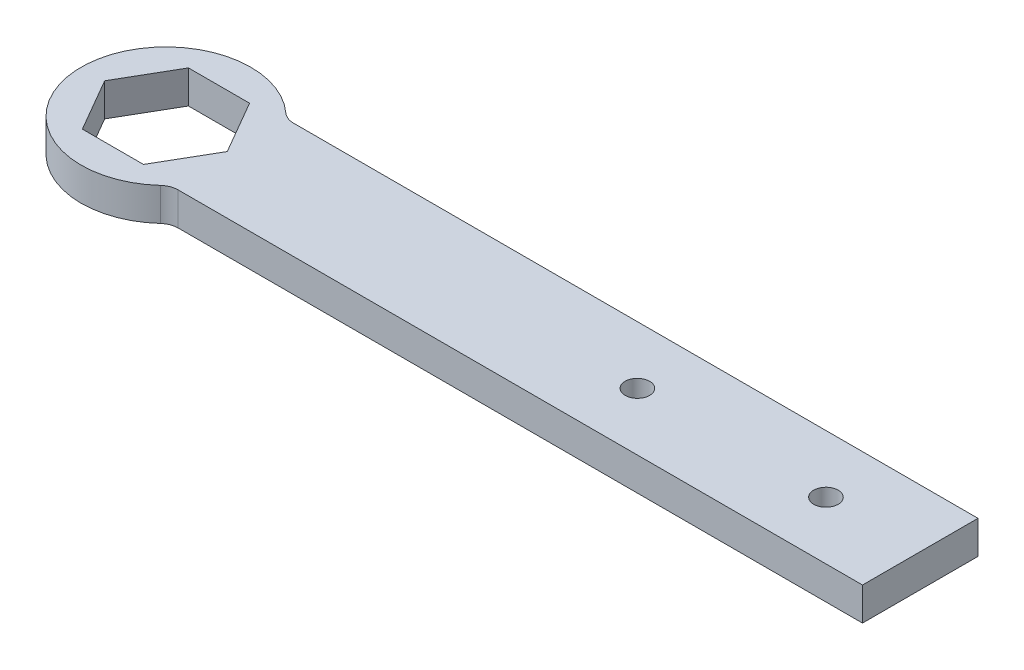
ISO-10303-21;
HEADER;
FILE_DESCRIPTION(('STEP AP214'),'2;1');
FILE_NAME('part.step','',(''),(''),'','','');
FILE_SCHEMA(('AUTOMOTIVE_DESIGN { 1 0 10303 214 1 1 1 1 }'));
ENDSEC;
DATA;
#1=APPLICATION_CONTEXT('core data for automotive mechanical design processes');
#2=APPLICATION_PROTOCOL_DEFINITION('international standard','automotive_design',2000,#1);
#3=PRODUCT_CONTEXT('',#1,'mechanical');
#4=PRODUCT('Part','Part','',(#3));
#5=PRODUCT_RELATED_PRODUCT_CATEGORY('part','',(#4));
#6=PRODUCT_DEFINITION_FORMATION('','',#4);
#7=PRODUCT_DEFINITION_CONTEXT('part definition',#1,'design');
#8=PRODUCT_DEFINITION('design','',#6,#7);
#9=PRODUCT_DEFINITION_SHAPE('','',#8);
#10=(LENGTH_UNIT() NAMED_UNIT(*) SI_UNIT(.MILLI.,.METRE.));
#11=(NAMED_UNIT(*) PLANE_ANGLE_UNIT() SI_UNIT($,.RADIAN.));
#12=(NAMED_UNIT(*) SI_UNIT($,.STERADIAN.) SOLID_ANGLE_UNIT());
#13=UNCERTAINTY_MEASURE_WITH_UNIT(LENGTH_MEASURE(1.E-05),#10,'distance_accuracy_value','');
#14=(GEOMETRIC_REPRESENTATION_CONTEXT(3) GLOBAL_UNCERTAINTY_ASSIGNED_CONTEXT((#13)) GLOBAL_UNIT_ASSIGNED_CONTEXT((#10,
#11,#12)) REPRESENTATION_CONTEXT('',''));
#15=CARTESIAN_POINT('',(0.,0.,0.));
#16=DIRECTION('',(0.,0.,1.));
#17=DIRECTION('',(1.,0.,0.));
#18=AXIS2_PLACEMENT_3D('',#15,#16,#17);
#19=CARTESIAN_POINT('',(13.5355856031245,4.445,17.4625));
#20=DIRECTION('',(0.,1.,0.));
#21=DIRECTION('',(0.,0.,1.));
#22=AXIS2_PLACEMENT_3D('',#19,#20,#21);
#23=PLANE('',#22);
#24=CARTESIAN_POINT('',(67.6183514848975,4.445,7.14374999999999));
#25=DIRECTION('',(0.,1.,0.));
#26=DIRECTION('',(0.,0.,1.));
#27=AXIS2_PLACEMENT_3D('',#24,#25,#26);
#28=CIRCLE('',#27,1.65100000000001);
#29=CARTESIAN_POINT('',(67.6183514848975,4.445,8.79475));
#30=VERTEX_POINT('',#29);
#31=EDGE_CURVE('E303',#30,#30,#28,.T.);
#32=ORIENTED_EDGE('',*,*,#31,.F.);
#33=EDGE_LOOP('',(#32));
#34=FACE_BOUND('',#33,.T.);
#35=CARTESIAN_POINT('',(93.0183514848975,4.445,7.14374999999999));
#36=DIRECTION('',(0.,1.,0.));
#37=DIRECTION('',(0.,0.,1.));
#38=AXIS2_PLACEMENT_3D('',#35,#36,#37);
#39=CIRCLE('',#38,1.65100000000001);
#40=CARTESIAN_POINT('',(93.0183514848975,4.445,8.79474999999999));
#41=VERTEX_POINT('',#40);
#42=EDGE_CURVE('E305',#41,#41,#39,.T.);
#43=ORIENTED_EDGE('',*,*,#42,.F.);
#44=EDGE_LOOP('',(#43));
#45=FACE_BOUND('',#44,.T.);
#46=CARTESIAN_POINT('',(13.5355856031245,4.445,17.4625));
#47=DIRECTION('',(0.,-1.,0.));
#48=DIRECTION('',(0.,0.,1.));
#49=AXIS2_PLACEMENT_3D('',#46,#47,#48);
#50=CIRCLE('',#49,2.54);
#51=CARTESIAN_POINT('',(11.8233612179923,4.445,15.5863636363636));
#52=VERTEX_POINT('',#51);
#53=CARTESIAN_POINT('',(13.5355856031245,4.445,14.9225));
#54=VERTEX_POINT('',#53);
#55=EDGE_CURVE('E185',#52,#54,#50,.T.);
#56=ORIENTED_EDGE('',*,*,#55,.T.);
#57=DIRECTION('',(1.,0.,0.));
#58=VECTOR('',#57,1.);
#59=CARTESIAN_POINT('',(105.718351484897,4.445,14.9225));
#60=LINE('',#59,#58);
#61=CARTESIAN_POINT('',(105.718351484897,4.445,14.9225));
#62=VERTEX_POINT('',#61);
#63=EDGE_CURVE('E188',#54,#62,#60,.T.);
#64=ORIENTED_EDGE('',*,*,#63,.T.);
#65=DIRECTION('',(0.,0.,-1.));
#66=VECTOR('',#65,1.);
#67=CARTESIAN_POINT('',(105.718351484897,4.445,-0.634999999999997));
#68=LINE('',#67,#66);
#69=CARTESIAN_POINT('',(105.718351484897,4.445,-0.634999999999997));
#70=VERTEX_POINT('',#69);
#71=EDGE_CURVE('E191',#62,#70,#68,.T.);
#72=ORIENTED_EDGE('',*,*,#71,.T.);
#73=DIRECTION('',(-1.,0.,0.));
#74=VECTOR('',#73,1.);
#75=CARTESIAN_POINT('',(13.5355856031245,4.445,-0.634999999999993));
#76=LINE('',#75,#74);
#77=CARTESIAN_POINT('',(13.5355856031245,4.445,-0.634999999999993));
#78=VERTEX_POINT('',#77);
#79=EDGE_CURVE('E193',#70,#78,#76,.T.);
#80=ORIENTED_EDGE('',*,*,#79,.T.);
#81=CARTESIAN_POINT('',(13.5355856031245,4.445,-3.17499999999999));
#82=DIRECTION('',(0.,-1.,0.));
#83=DIRECTION('',(0.,0.,1.));
#84=AXIS2_PLACEMENT_3D('',#81,#82,#83);
#85=CIRCLE('',#84,2.54);
#86=CARTESIAN_POINT('',(11.8233612179923,4.445,-1.29886363636363));
#87=VERTEX_POINT('',#86);
#88=EDGE_CURVE('E195',#78,#87,#85,.T.);
#89=ORIENTED_EDGE('',*,*,#88,.T.);
#90=CARTESIAN_POINT('',(4.11835148489746,4.445,7.14375));
#91=DIRECTION('',(0.,1.,0.));
#92=DIRECTION('',(0.,0.,1.));
#93=AXIS2_PLACEMENT_3D('',#90,#91,#92);
#94=CIRCLE('',#93,11.43);
#95=EDGE_CURVE('E197',#87,#52,#94,.T.);
#96=ORIENTED_EDGE('',*,*,#95,.T.);
#97=EDGE_LOOP('',(#56,#64,#72,#80,#89,#96));
#98=FACE_BOUND('',#97,.T.);
#99=DIRECTION('',(0.501108239261361,0.,0.865384615384615));
#100=VECTOR('',#99,1.);
#101=CARTESIAN_POINT('',(0.,4.445,14.2875));
#102=LINE('',#101,#100);
#103=CARTESIAN_POINT('',(-4.13664851510254,4.445,7.14375));
#104=VERTEX_POINT('',#103);
#105=CARTESIAN_POINT('',(0.,4.445,14.2875));
#106=VERTEX_POINT('',#105);
#107=EDGE_CURVE('E140',#104,#106,#102,.T.);
#108=ORIENTED_EDGE('',*,*,#107,.F.);
#109=DIRECTION('',(-0.501108239261361,0.,0.865384615384615));
#110=VECTOR('',#109,1.);
#111=CARTESIAN_POINT('',(-4.13664851510254,4.445,7.14375));
#112=LINE('',#111,#110);
#113=CARTESIAN_POINT('',(0.,4.445,0.));
#114=VERTEX_POINT('',#113);
#115=EDGE_CURVE('E132',#114,#104,#112,.T.);
#116=ORIENTED_EDGE('',*,*,#115,.F.);
#117=DIRECTION('',(-1.,0.,0.));
#118=VECTOR('',#117,1.);
#119=CARTESIAN_POINT('',(0.,4.445,0.));
#120=LINE('',#119,#118);
#121=CARTESIAN_POINT('',(8.23670296979493,4.445,0.));
#122=VERTEX_POINT('',#121);
#123=EDGE_CURVE('E162',#122,#114,#120,.T.);
#124=ORIENTED_EDGE('',*,*,#123,.F.);
#125=DIRECTION('',(-0.501108239261361,0.,-0.865384615384615));
#126=VECTOR('',#125,1.);
#127=CARTESIAN_POINT('',(8.23670296979493,4.445,0.));
#128=LINE('',#127,#126);
#129=CARTESIAN_POINT('',(12.3733514848975,4.445,7.14375));
#130=VERTEX_POINT('',#129);
#131=EDGE_CURVE('E160',#130,#122,#128,.T.);
#132=ORIENTED_EDGE('',*,*,#131,.F.);
#133=DIRECTION('',(0.501108239261361,0.,-0.865384615384616));
#134=VECTOR('',#133,1.);
#135=CARTESIAN_POINT('',(12.3733514848975,4.445,7.14375));
#136=LINE('',#135,#134);
#137=CARTESIAN_POINT('',(8.23670296979493,4.445,14.2875));
#138=VERTEX_POINT('',#137);
#139=EDGE_CURVE('E155',#138,#130,#136,.T.);
#140=ORIENTED_EDGE('',*,*,#139,.F.);
#141=DIRECTION('',(1.,0.,0.));
#142=VECTOR('',#141,1.);
#143=CARTESIAN_POINT('',(8.23670296979493,4.445,14.2875));
#144=LINE('',#143,#142);
#145=EDGE_CURVE('E153',#106,#138,#144,.T.);
#146=ORIENTED_EDGE('',*,*,#145,.F.);
#147=EDGE_LOOP('',(#108,#116,#124,#132,#140,#146));
#148=FACE_BOUND('',#147,.T.);
#149=ADVANCED_FACE('F43',(#34,#45,#98,#148),#23,.T.);
#150=CARTESIAN_POINT('',(13.5355856031245,0.,17.4625));
#151=DIRECTION('',(0.,1.,0.));
#152=DIRECTION('',(0.,0.,1.));
#153=AXIS2_PLACEMENT_3D('',#150,#151,#152);
#154=PLANE('',#153);
#155=CARTESIAN_POINT('',(67.6183514848975,0.,7.14374999999999));
#156=DIRECTION('',(0.,1.,0.));
#157=DIRECTION('',(0.,0.,1.));
#158=AXIS2_PLACEMENT_3D('',#155,#156,#157);
#159=CIRCLE('',#158,1.65100000000001);
#160=CARTESIAN_POINT('',(67.6183514848975,0.,8.79475));
#161=VERTEX_POINT('',#160);
#162=EDGE_CURVE('E301',#161,#161,#159,.T.);
#163=ORIENTED_EDGE('',*,*,#162,.T.);
#164=EDGE_LOOP('',(#163));
#165=FACE_BOUND('',#164,.T.);
#166=CARTESIAN_POINT('',(93.0183514848975,0.,7.14374999999999));
#167=DIRECTION('',(0.,1.,0.));
#168=DIRECTION('',(0.,0.,1.));
#169=AXIS2_PLACEMENT_3D('',#166,#167,#168);
#170=CIRCLE('',#169,1.65100000000001);
#171=CARTESIAN_POINT('',(93.0183514848975,0.,8.79474999999999));
#172=VERTEX_POINT('',#171);
#173=EDGE_CURVE('E165',#172,#172,#170,.T.);
#174=ORIENTED_EDGE('',*,*,#173,.T.);
#175=EDGE_LOOP('',(#174));
#176=FACE_BOUND('',#175,.T.);
#177=CARTESIAN_POINT('',(13.5355856031245,0.,17.4625));
#178=DIRECTION('',(0.,-1.,0.));
#179=DIRECTION('',(0.,0.,1.));
#180=AXIS2_PLACEMENT_3D('',#177,#178,#179);
#181=CIRCLE('',#180,2.54);
#182=CARTESIAN_POINT('',(11.8233612179923,0.,15.5863636363636));
#183=VERTEX_POINT('',#182);
#184=CARTESIAN_POINT('',(13.5355856031245,0.,14.9225));
#185=VERTEX_POINT('',#184);
#186=EDGE_CURVE('E148',#183,#185,#181,.T.);
#187=ORIENTED_EDGE('',*,*,#186,.F.);
#188=CARTESIAN_POINT('',(4.11835148489746,0.,7.14375));
#189=DIRECTION('',(0.,1.,0.));
#190=DIRECTION('',(0.,0.,1.));
#191=AXIS2_PLACEMENT_3D('',#188,#189,#190);
#192=CIRCLE('',#191,11.43);
#193=CARTESIAN_POINT('',(11.8233612179923,0.,-1.29886363636363));
#194=VERTEX_POINT('',#193);
#195=EDGE_CURVE('E189',#194,#183,#192,.T.);
#196=ORIENTED_EDGE('',*,*,#195,.F.);
#197=CARTESIAN_POINT('',(13.5355856031245,0.,-3.17499999999999));
#198=DIRECTION('',(0.,-1.,0.));
#199=DIRECTION('',(0.,0.,1.));
#200=AXIS2_PLACEMENT_3D('',#197,#198,#199);
#201=CIRCLE('',#200,2.54);
#202=CARTESIAN_POINT('',(13.5355856031245,0.,-0.634999999999993));
#203=VERTEX_POINT('',#202);
#204=EDGE_CURVE('E208',#203,#194,#201,.T.);
#205=ORIENTED_EDGE('',*,*,#204,.F.);
#206=DIRECTION('',(-1.,0.,0.));
#207=VECTOR('',#206,1.);
#208=CARTESIAN_POINT('',(13.5355856031245,0.,-0.634999999999993));
#209=LINE('',#208,#207);
#210=CARTESIAN_POINT('',(105.718351484897,0.,-0.634999999999997));
#211=VERTEX_POINT('',#210);
#212=EDGE_CURVE('E206',#211,#203,#209,.T.);
#213=ORIENTED_EDGE('',*,*,#212,.F.);
#214=DIRECTION('',(0.,0.,-1.));
#215=VECTOR('',#214,1.);
#216=CARTESIAN_POINT('',(105.718351484897,0.,-0.634999999999997));
#217=LINE('',#216,#215);
#218=CARTESIAN_POINT('',(105.718351484897,0.,14.9225));
#219=VERTEX_POINT('',#218);
#220=EDGE_CURVE('E204',#219,#211,#217,.T.);
#221=ORIENTED_EDGE('',*,*,#220,.F.);
#222=DIRECTION('',(1.,0.,0.));
#223=VECTOR('',#222,1.);
#224=CARTESIAN_POINT('',(105.718351484897,0.,14.9225));
#225=LINE('',#224,#223);
#226=EDGE_CURVE('E202',#185,#219,#225,.T.);
#227=ORIENTED_EDGE('',*,*,#226,.F.);
#228=EDGE_LOOP('',(#187,#196,#205,#213,#221,#227));
#229=FACE_BOUND('',#228,.T.);
#230=DIRECTION('',(-0.501108239261361,0.,0.865384615384615));
#231=VECTOR('',#230,1.);
#232=CARTESIAN_POINT('',(-4.13664851510254,0.,7.14375));
#233=LINE('',#232,#231);
#234=CARTESIAN_POINT('',(0.,0.,0.));
#235=VERTEX_POINT('',#234);
#236=CARTESIAN_POINT('',(-4.13664851510254,0.,7.14375));
#237=VERTEX_POINT('',#236);
#238=EDGE_CURVE('E66',#235,#237,#233,.T.);
#239=ORIENTED_EDGE('',*,*,#238,.T.);
#240=DIRECTION('',(0.501108239261361,0.,0.865384615384615));
#241=VECTOR('',#240,1.);
#242=CARTESIAN_POINT('',(0.,0.,14.2875));
#243=LINE('',#242,#241);
#244=CARTESIAN_POINT('',(0.,0.,14.2875));
#245=VERTEX_POINT('',#244);
#246=EDGE_CURVE('E147',#237,#245,#243,.T.);
#247=ORIENTED_EDGE('',*,*,#246,.T.);
#248=DIRECTION('',(1.,0.,0.));
#249=VECTOR('',#248,1.);
#250=CARTESIAN_POINT('',(8.23670296979493,0.,14.2875));
#251=LINE('',#250,#249);
#252=CARTESIAN_POINT('',(8.23670296979493,0.,14.2875));
#253=VERTEX_POINT('',#252);
#254=EDGE_CURVE('E167',#245,#253,#251,.T.);
#255=ORIENTED_EDGE('',*,*,#254,.T.);
#256=DIRECTION('',(0.501108239261361,0.,-0.865384615384616));
#257=VECTOR('',#256,1.);
#258=CARTESIAN_POINT('',(12.3733514848975,0.,7.14375));
#259=LINE('',#258,#257);
#260=CARTESIAN_POINT('',(12.3733514848975,0.,7.14375));
#261=VERTEX_POINT('',#260);
#262=EDGE_CURVE('E170',#253,#261,#259,.T.);
#263=ORIENTED_EDGE('',*,*,#262,.T.);
#264=DIRECTION('',(-0.501108239261361,0.,-0.865384615384615));
#265=VECTOR('',#264,1.);
#266=CARTESIAN_POINT('',(8.23670296979493,0.,0.));
#267=LINE('',#266,#265);
#268=CARTESIAN_POINT('',(8.23670296979493,0.,0.));
#269=VERTEX_POINT('',#268);
#270=EDGE_CURVE('E173',#261,#269,#267,.T.);
#271=ORIENTED_EDGE('',*,*,#270,.T.);
#272=DIRECTION('',(-1.,0.,0.));
#273=VECTOR('',#272,1.);
#274=CARTESIAN_POINT('',(0.,0.,0.));
#275=LINE('',#274,#273);
#276=EDGE_CURVE('E141',#269,#235,#275,.T.);
#277=ORIENTED_EDGE('',*,*,#276,.T.);
#278=EDGE_LOOP('',(#239,#247,#255,#263,#271,#277));
#279=FACE_BOUND('',#278,.T.);
#280=ADVANCED_FACE('F232',(#165,#176,#229,#279),#154,.F.);
#281=CARTESIAN_POINT('',(13.5355856031245,4.445,17.4625));
#282=DIRECTION('',(0.,-1.,0.));
#283=DIRECTION('',(0.,0.,-1.));
#284=AXIS2_PLACEMENT_3D('',#281,#282,#283);
#285=CYLINDRICAL_SURFACE('',#284,2.54);
#286=ORIENTED_EDGE('',*,*,#186,.T.);
#287=DIRECTION('',(0.,-1.,0.));
#288=VECTOR('',#287,1.);
#289=CARTESIAN_POINT('',(13.5355856031245,4.445,14.9225));
#290=LINE('',#289,#288);
#291=EDGE_CURVE('E13',#54,#185,#290,.T.);
#292=ORIENTED_EDGE('',*,*,#291,.F.);
#293=ORIENTED_EDGE('',*,*,#55,.F.);
#294=DIRECTION('',(0.,-1.,0.));
#295=VECTOR('',#294,1.);
#296=CARTESIAN_POINT('',(11.8233612179923,4.445,15.5863636363636));
#297=LINE('',#296,#295);
#298=EDGE_CURVE('E199',#52,#183,#297,.T.);
#299=ORIENTED_EDGE('',*,*,#298,.T.);
#300=EDGE_LOOP('',(#286,#292,#293,#299));
#301=FACE_BOUND('',#300,.T.);
#302=ADVANCED_FACE('F45',(#301),#285,.F.);
#303=CARTESIAN_POINT('',(105.718351484897,4.445,14.9225));
#304=DIRECTION('',(0.,0.,-1.));
#305=DIRECTION('',(-1.,0.,0.));
#306=AXIS2_PLACEMENT_3D('',#303,#304,#305);
#307=PLANE('',#306);
#308=ORIENTED_EDGE('',*,*,#226,.T.);
#309=DIRECTION('',(0.,-1.,0.));
#310=VECTOR('',#309,1.);
#311=CARTESIAN_POINT('',(105.718351484897,4.445,14.9225));
#312=LINE('',#311,#310);
#313=EDGE_CURVE('E51',#62,#219,#312,.T.);
#314=ORIENTED_EDGE('',*,*,#313,.F.);
#315=ORIENTED_EDGE('',*,*,#63,.F.);
#316=ORIENTED_EDGE('',*,*,#291,.T.);
#317=EDGE_LOOP('',(#308,#314,#315,#316));
#318=FACE_BOUND('',#317,.T.);
#319=ADVANCED_FACE('F249',(#318),#307,.F.);
#320=CARTESIAN_POINT('',(105.718351484897,4.445,-0.634999999999997));
#321=DIRECTION('',(-1.,0.,0.));
#322=DIRECTION('',(0.,0.,1.));
#323=AXIS2_PLACEMENT_3D('',#320,#321,#322);
#324=PLANE('',#323);
#325=ORIENTED_EDGE('',*,*,#220,.T.);
#326=DIRECTION('',(0.,-1.,0.));
#327=VECTOR('',#326,1.);
#328=CARTESIAN_POINT('',(105.718351484897,4.445,-0.634999999999997));
#329=LINE('',#328,#327);
#330=EDGE_CURVE('E219',#70,#211,#329,.T.);
#331=ORIENTED_EDGE('',*,*,#330,.F.);
#332=ORIENTED_EDGE('',*,*,#71,.F.);
#333=ORIENTED_EDGE('',*,*,#313,.T.);
#334=EDGE_LOOP('',(#325,#331,#332,#333));
#335=FACE_BOUND('',#334,.T.);
#336=ADVANCED_FACE('F226',(#335),#324,.F.);
#337=CARTESIAN_POINT('',(13.5355856031245,4.445,-0.634999999999993));
#338=DIRECTION('',(0.,0.,1.));
#339=DIRECTION('',(1.,0.,0.));
#340=AXIS2_PLACEMENT_3D('',#337,#338,#339);
#341=PLANE('',#340);
#342=ORIENTED_EDGE('',*,*,#212,.T.);
#343=DIRECTION('',(0.,-1.,0.));
#344=VECTOR('',#343,1.);
#345=CARTESIAN_POINT('',(13.5355856031245,4.445,-0.634999999999993));
#346=LINE('',#345,#344);
#347=EDGE_CURVE('E216',#78,#203,#346,.T.);
#348=ORIENTED_EDGE('',*,*,#347,.F.);
#349=ORIENTED_EDGE('',*,*,#79,.F.);
#350=ORIENTED_EDGE('',*,*,#330,.T.);
#351=EDGE_LOOP('',(#342,#348,#349,#350));
#352=FACE_BOUND('',#351,.T.);
#353=ADVANCED_FACE('F238',(#352),#341,.F.);
#354=CARTESIAN_POINT('',(13.5355856031245,4.445,-3.17499999999999));
#355=DIRECTION('',(0.,-1.,0.));
#356=DIRECTION('',(0.,0.,-1.));
#357=AXIS2_PLACEMENT_3D('',#354,#355,#356);
#358=CYLINDRICAL_SURFACE('',#357,2.54);
#359=ORIENTED_EDGE('',*,*,#204,.T.);
#360=DIRECTION('',(0.,-1.,0.));
#361=VECTOR('',#360,1.);
#362=CARTESIAN_POINT('',(11.8233612179923,4.445,-1.29886363636363));
#363=LINE('',#362,#361);
#364=EDGE_CURVE('E213',#87,#194,#363,.T.);
#365=ORIENTED_EDGE('',*,*,#364,.F.);
#366=ORIENTED_EDGE('',*,*,#88,.F.);
#367=ORIENTED_EDGE('',*,*,#347,.T.);
#368=EDGE_LOOP('',(#359,#365,#366,#367));
#369=FACE_BOUND('',#368,.T.);
#370=ADVANCED_FACE('F242',(#369),#358,.F.);
#371=CARTESIAN_POINT('',(4.11835148489746,4.445,7.14375));
#372=DIRECTION('',(0.,-1.,0.));
#373=DIRECTION('',(0.,0.,-1.));
#374=AXIS2_PLACEMENT_3D('',#371,#372,#373);
#375=CYLINDRICAL_SURFACE('',#374,11.43);
#376=ORIENTED_EDGE('',*,*,#195,.T.);
#377=ORIENTED_EDGE('',*,*,#298,.F.);
#378=ORIENTED_EDGE('',*,*,#95,.F.);
#379=ORIENTED_EDGE('',*,*,#364,.T.);
#380=EDGE_LOOP('',(#376,#377,#378,#379));
#381=FACE_BOUND('',#380,.T.);
#382=ADVANCED_FACE('F252',(#381),#375,.T.);
#383=CARTESIAN_POINT('',(-4.13664851510254,4.445,7.14375));
#384=DIRECTION('',(0.865384615384615,0.,0.501108239261361));
#385=DIRECTION('',(0.501108239261361,0.,-0.865384615384615));
#386=AXIS2_PLACEMENT_3D('',#383,#384,#385);
#387=PLANE('',#386);
#388=ORIENTED_EDGE('',*,*,#238,.F.);
#389=DIRECTION('',(0.,-1.,0.));
#390=VECTOR('',#389,1.);
#391=CARTESIAN_POINT('',(0.,4.445,0.));
#392=LINE('',#391,#390);
#393=EDGE_CURVE('E136',#114,#235,#392,.T.);
#394=ORIENTED_EDGE('',*,*,#393,.F.);
#395=ORIENTED_EDGE('',*,*,#115,.T.);
#396=DIRECTION('',(0.,-1.,0.));
#397=VECTOR('',#396,1.);
#398=CARTESIAN_POINT('',(-4.13664851510254,4.445,7.14375));
#399=LINE('',#398,#397);
#400=EDGE_CURVE('E135',#104,#237,#399,.T.);
#401=ORIENTED_EDGE('',*,*,#400,.T.);
#402=EDGE_LOOP('',(#388,#394,#395,#401));
#403=FACE_BOUND('',#402,.T.);
#404=ADVANCED_FACE('F134',(#403),#387,.T.);
#405=CARTESIAN_POINT('',(0.,4.445,14.2875));
#406=DIRECTION('',(0.865384615384615,0.,-0.501108239261361));
#407=DIRECTION('',(-0.501108239261361,0.,-0.865384615384616));
#408=AXIS2_PLACEMENT_3D('',#405,#406,#407);
#409=PLANE('',#408);
#410=ORIENTED_EDGE('',*,*,#246,.F.);
#411=ORIENTED_EDGE('',*,*,#400,.F.);
#412=ORIENTED_EDGE('',*,*,#107,.T.);
#413=DIRECTION('',(0.,-1.,0.));
#414=VECTOR('',#413,1.);
#415=CARTESIAN_POINT('',(0.,4.445,14.2875));
#416=LINE('',#415,#414);
#417=EDGE_CURVE('E149',#106,#245,#416,.T.);
#418=ORIENTED_EDGE('',*,*,#417,.T.);
#419=EDGE_LOOP('',(#410,#411,#412,#418));
#420=FACE_BOUND('',#419,.T.);
#421=ADVANCED_FACE('F144',(#420),#409,.T.);
#422=CARTESIAN_POINT('',(8.23670296979493,4.445,14.2875));
#423=DIRECTION('',(0.,0.,-1.));
#424=DIRECTION('',(-1.,0.,0.));
#425=AXIS2_PLACEMENT_3D('',#422,#423,#424);
#426=PLANE('',#425);
#427=ORIENTED_EDGE('',*,*,#254,.F.);
#428=ORIENTED_EDGE('',*,*,#417,.F.);
#429=ORIENTED_EDGE('',*,*,#145,.T.);
#430=DIRECTION('',(0.,-1.,0.));
#431=VECTOR('',#430,1.);
#432=CARTESIAN_POINT('',(8.23670296979493,4.445,14.2875));
#433=LINE('',#432,#431);
#434=EDGE_CURVE('E182',#138,#253,#433,.T.);
#435=ORIENTED_EDGE('',*,*,#434,.T.);
#436=EDGE_LOOP('',(#427,#428,#429,#435));
#437=FACE_BOUND('',#436,.T.);
#438=ADVANCED_FACE('F274',(#437),#426,.T.);
#439=CARTESIAN_POINT('',(12.3733514848975,4.445,7.14375));
#440=DIRECTION('',(-0.865384615384615,0.,-0.501108239261361));
#441=DIRECTION('',(-0.501108239261361,0.,0.865384615384616));
#442=AXIS2_PLACEMENT_3D('',#439,#440,#441);
#443=PLANE('',#442);
#444=ORIENTED_EDGE('',*,*,#262,.F.);
#445=ORIENTED_EDGE('',*,*,#434,.F.);
#446=ORIENTED_EDGE('',*,*,#139,.T.);
#447=DIRECTION('',(0.,-1.,0.));
#448=VECTOR('',#447,1.);
#449=CARTESIAN_POINT('',(12.3733514848975,4.445,7.14375));
#450=LINE('',#449,#448);
#451=EDGE_CURVE('E180',#130,#261,#450,.T.);
#452=ORIENTED_EDGE('',*,*,#451,.T.);
#453=EDGE_LOOP('',(#444,#445,#446,#452));
#454=FACE_BOUND('',#453,.T.);
#455=ADVANCED_FACE('F277',(#454),#443,.T.);
#456=CARTESIAN_POINT('',(8.23670296979493,4.445,0.));
#457=DIRECTION('',(-0.865384615384615,0.,0.501108239261361));
#458=DIRECTION('',(0.501108239261361,0.,0.865384615384616));
#459=AXIS2_PLACEMENT_3D('',#456,#457,#458);
#460=PLANE('',#459);
#461=ORIENTED_EDGE('',*,*,#270,.F.);
#462=ORIENTED_EDGE('',*,*,#451,.F.);
#463=ORIENTED_EDGE('',*,*,#131,.T.);
#464=DIRECTION('',(0.,-1.,0.));
#465=VECTOR('',#464,1.);
#466=CARTESIAN_POINT('',(8.23670296979493,4.445,0.));
#467=LINE('',#466,#465);
#468=EDGE_CURVE('E58',#122,#269,#467,.T.);
#469=ORIENTED_EDGE('',*,*,#468,.T.);
#470=EDGE_LOOP('',(#461,#462,#463,#469));
#471=FACE_BOUND('',#470,.T.);
#472=ADVANCED_FACE('F281',(#471),#460,.T.);
#473=CARTESIAN_POINT('',(0.,4.445,0.));
#474=DIRECTION('',(0.,0.,1.));
#475=DIRECTION('',(1.,0.,0.));
#476=AXIS2_PLACEMENT_3D('',#473,#474,#475);
#477=PLANE('',#476);
#478=ORIENTED_EDGE('',*,*,#276,.F.);
#479=ORIENTED_EDGE('',*,*,#468,.F.);
#480=ORIENTED_EDGE('',*,*,#123,.T.);
#481=ORIENTED_EDGE('',*,*,#393,.T.);
#482=EDGE_LOOP('',(#478,#479,#480,#481));
#483=FACE_BOUND('',#482,.T.);
#484=ADVANCED_FACE('F285',(#483),#477,.T.);
#485=CARTESIAN_POINT('',(93.0183514848975,0.,7.14374999999999));
#486=DIRECTION('',(0.,1.,0.));
#487=DIRECTION('',(0.,0.,1.));
#488=AXIS2_PLACEMENT_3D('',#485,#486,#487);
#489=CYLINDRICAL_SURFACE('',#488,1.65100000000001);
#490=ORIENTED_EDGE('',*,*,#173,.F.);
#491=EDGE_LOOP('',(#490));
#492=FACE_BOUND('',#491,.T.);
#493=ORIENTED_EDGE('',*,*,#42,.T.);
#494=EDGE_LOOP('',(#493));
#495=FACE_BOUND('',#494,.T.);
#496=ADVANCED_FACE('F289',(#492,#495),#489,.F.);
#497=CARTESIAN_POINT('',(67.6183514848975,0.,7.14374999999999));
#498=DIRECTION('',(0.,1.,0.));
#499=DIRECTION('',(0.,0.,1.));
#500=AXIS2_PLACEMENT_3D('',#497,#498,#499);
#501=CYLINDRICAL_SURFACE('',#500,1.65100000000001);
#502=ORIENTED_EDGE('',*,*,#162,.F.);
#503=EDGE_LOOP('',(#502));
#504=FACE_BOUND('',#503,.T.);
#505=ORIENTED_EDGE('',*,*,#31,.T.);
#506=EDGE_LOOP('',(#505));
#507=FACE_BOUND('',#506,.T.);
#508=ADVANCED_FACE('F292',(#504,#507),#501,.F.);
#509=CLOSED_SHELL('',(#149,#280,#302,#319,#336,#353,#370,#382,#404,#421,#438,#455,#472,#484,
#496,#508));
#510=MANIFOLD_SOLID_BREP('B2',#509);
#511=ADVANCED_BREP_SHAPE_REPRESENTATION('',(#18,#510),#14);
#512=SHAPE_DEFINITION_REPRESENTATION(#9,#511);
ENDSEC;
END-ISO-10303-21;
